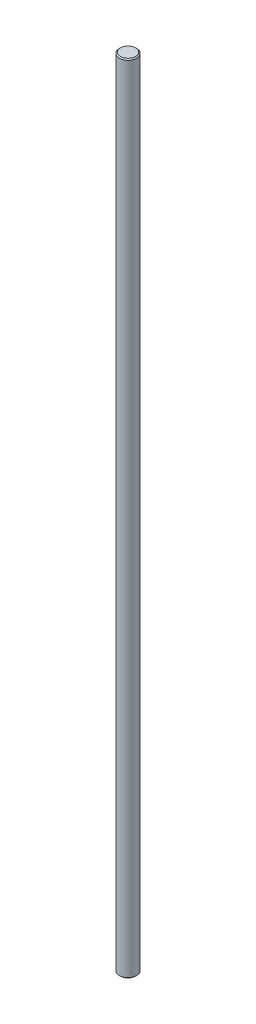
ISO-10303-21;
HEADER;
FILE_DESCRIPTION(('STEP AP214'),'2;1');
FILE_NAME('part.step','',(''),(''),'','','');
FILE_SCHEMA(('AUTOMOTIVE_DESIGN { 1 0 10303 214 1 1 1 1 }'));
ENDSEC;
DATA;
#1=APPLICATION_CONTEXT('core data for automotive mechanical design processes');
#2=APPLICATION_PROTOCOL_DEFINITION('international standard','automotive_design',2000,#1);
#3=PRODUCT_CONTEXT('',#1,'mechanical');
#4=PRODUCT('Part','Part','',(#3));
#5=PRODUCT_RELATED_PRODUCT_CATEGORY('part','',(#4));
#6=PRODUCT_DEFINITION_FORMATION('','',#4);
#7=PRODUCT_DEFINITION_CONTEXT('part definition',#1,'design');
#8=PRODUCT_DEFINITION('design','',#6,#7);
#9=PRODUCT_DEFINITION_SHAPE('','',#8);
#10=(LENGTH_UNIT() NAMED_UNIT(*) SI_UNIT(.MILLI.,.METRE.));
#11=(NAMED_UNIT(*) PLANE_ANGLE_UNIT() SI_UNIT($,.RADIAN.));
#12=(NAMED_UNIT(*) SI_UNIT($,.STERADIAN.) SOLID_ANGLE_UNIT());
#13=UNCERTAINTY_MEASURE_WITH_UNIT(LENGTH_MEASURE(1.E-05),#10,'distance_accuracy_value','');
#14=(GEOMETRIC_REPRESENTATION_CONTEXT(3) GLOBAL_UNCERTAINTY_ASSIGNED_CONTEXT((#13)) GLOBAL_UNIT_ASSIGNED_CONTEXT((#10,
#11,#12)) REPRESENTATION_CONTEXT('',''));
#15=CARTESIAN_POINT('',(0.,0.,0.));
#16=DIRECTION('',(0.,0.,1.));
#17=DIRECTION('',(1.,0.,0.));
#18=AXIS2_PLACEMENT_3D('',#15,#16,#17);
#19=CARTESIAN_POINT('',(0.,185.,0.));
#20=DIRECTION('',(0.,-1.,0.));
#21=DIRECTION('',(0.,0.,-1.));
#22=AXIS2_PLACEMENT_3D('',#19,#20,#21);
#23=CYLINDRICAL_SURFACE('',#22,4.);
#24=CARTESIAN_POINT('',(0.,-184.5,0.));
#25=DIRECTION('',(0.,1.,0.));
#26=DIRECTION('',(0.,0.,1.));
#27=AXIS2_PLACEMENT_3D('',#24,#25,#26);
#28=CIRCLE('',#27,4.);
#29=CARTESIAN_POINT('',(0.,-184.5,4.));
#30=VERTEX_POINT('',#29);
#31=EDGE_CURVE('E41',#30,#30,#28,.T.);
#32=ORIENTED_EDGE('',*,*,#31,.T.);
#33=EDGE_LOOP('',(#32));
#34=FACE_BOUND('',#33,.T.);
#35=CARTESIAN_POINT('',(0.,184.5,0.));
#36=DIRECTION('',(0.,1.,0.));
#37=DIRECTION('',(0.,0.,1.));
#38=AXIS2_PLACEMENT_3D('',#35,#36,#37);
#39=CIRCLE('',#38,4.);
#40=CARTESIAN_POINT('',(0.,184.5,4.));
#41=VERTEX_POINT('',#40);
#42=EDGE_CURVE('E45',#41,#41,#39,.F.);
#43=ORIENTED_EDGE('',*,*,#42,.T.);
#44=EDGE_LOOP('',(#43));
#45=FACE_BOUND('',#44,.T.);
#46=ADVANCED_FACE('F30',(#34,#45),#23,.T.);
#47=CARTESIAN_POINT('',(0.,185.,0.));
#48=DIRECTION('',(0.,1.,0.));
#49=DIRECTION('',(0.,0.,1.));
#50=AXIS2_PLACEMENT_3D('',#47,#48,#49);
#51=PLANE('',#50);
#52=CARTESIAN_POINT('',(0.,185.,0.));
#53=DIRECTION('',(0.,1.,0.));
#54=DIRECTION('',(0.,0.,1.));
#55=AXIS2_PLACEMENT_3D('',#52,#53,#54);
#56=CIRCLE('',#55,3.5);
#57=CARTESIAN_POINT('',(0.,185.,3.5));
#58=VERTEX_POINT('',#57);
#59=EDGE_CURVE('E10',#58,#58,#56,.T.);
#60=ORIENTED_EDGE('',*,*,#59,.T.);
#61=EDGE_LOOP('',(#60));
#62=FACE_BOUND('',#61,.T.);
#63=ADVANCED_FACE('F61',(#62),#51,.T.);
#64=CARTESIAN_POINT('',(0.,-185.,0.));
#65=DIRECTION('',(0.,1.,0.));
#66=DIRECTION('',(0.,0.,1.));
#67=AXIS2_PLACEMENT_3D('',#64,#65,#66);
#68=PLANE('',#67);
#69=CARTESIAN_POINT('',(0.,-185.,0.));
#70=DIRECTION('',(0.,1.,0.));
#71=DIRECTION('',(0.,0.,1.));
#72=AXIS2_PLACEMENT_3D('',#69,#70,#71);
#73=CIRCLE('',#72,3.50000000000006);
#74=CARTESIAN_POINT('',(0.,-185.,3.50000000000006));
#75=VERTEX_POINT('',#74);
#76=EDGE_CURVE('E37',#75,#75,#73,.F.);
#77=ORIENTED_EDGE('',*,*,#76,.T.);
#78=EDGE_LOOP('',(#77));
#79=FACE_BOUND('',#78,.T.);
#80=ADVANCED_FACE('F58',(#79),#68,.F.);
#81=CARTESIAN_POINT('',(0.,-184.5,0.));
#82=DIRECTION('',(0.,1.,0.));
#83=DIRECTION('',(0.,0.,1.));
#84=AXIS2_PLACEMENT_3D('',#81,#82,#83);
#85=CONICAL_SURFACE('',#84,4.,0.785398163397445);
#86=ORIENTED_EDGE('',*,*,#76,.F.);
#87=EDGE_LOOP('',(#86));
#88=FACE_BOUND('',#87,.T.);
#89=ORIENTED_EDGE('',*,*,#31,.F.);
#90=EDGE_LOOP('',(#89));
#91=FACE_BOUND('',#90,.T.);
#92=ADVANCED_FACE('F54',(#88,#91),#85,.T.);
#93=CARTESIAN_POINT('',(0.,185.,0.));
#94=DIRECTION('',(0.,-1.,0.));
#95=DIRECTION('',(0.,0.,-1.));
#96=AXIS2_PLACEMENT_3D('',#93,#94,#95);
#97=CONICAL_SURFACE('',#96,3.5,0.785398163397445);
#98=ORIENTED_EDGE('',*,*,#42,.F.);
#99=EDGE_LOOP('',(#98));
#100=FACE_BOUND('',#99,.T.);
#101=ORIENTED_EDGE('',*,*,#59,.F.);
#102=EDGE_LOOP('',(#101));
#103=FACE_BOUND('',#102,.T.);
#104=ADVANCED_FACE('F32',(#100,#103),#97,.T.);
#105=CLOSED_SHELL('',(#46,#63,#80,#92,#104));
#106=MANIFOLD_SOLID_BREP('B2',#105);
#107=ADVANCED_BREP_SHAPE_REPRESENTATION('',(#18,#106),#14);
#108=SHAPE_DEFINITION_REPRESENTATION(#9,#107);
ENDSEC;
END-ISO-10303-21;
